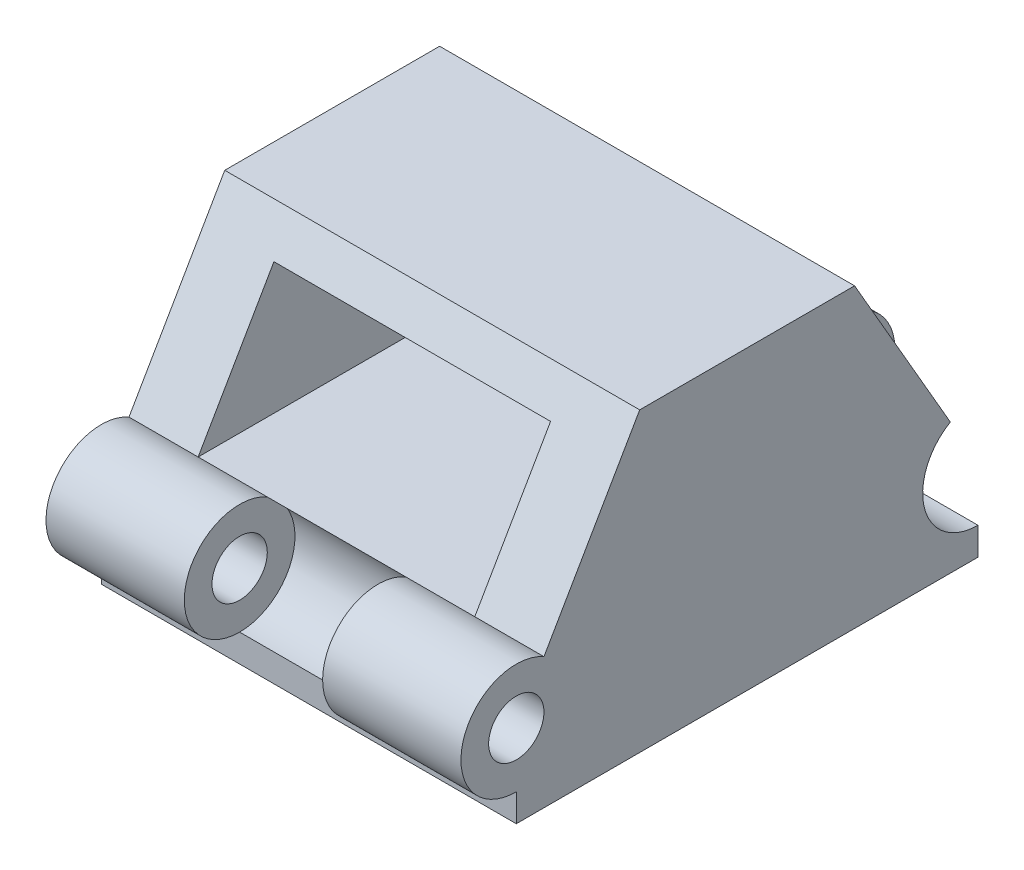
ISO-10303-21;
HEADER;
FILE_DESCRIPTION(('STEP AP214'),'2;1');
FILE_NAME('part.step','',(''),(''),'','','');
FILE_SCHEMA(('AUTOMOTIVE_DESIGN { 1 0 10303 214 1 1 1 1 }'));
ENDSEC;
DATA;
#1=APPLICATION_CONTEXT('core data for automotive mechanical design processes');
#2=APPLICATION_PROTOCOL_DEFINITION('international standard','automotive_design',2000,#1);
#3=PRODUCT_CONTEXT('',#1,'mechanical');
#4=PRODUCT('Part','Part','',(#3));
#5=PRODUCT_RELATED_PRODUCT_CATEGORY('part','',(#4));
#6=PRODUCT_DEFINITION_FORMATION('','',#4);
#7=PRODUCT_DEFINITION_CONTEXT('part definition',#1,'design');
#8=PRODUCT_DEFINITION('design','',#6,#7);
#9=PRODUCT_DEFINITION_SHAPE('','',#8);
#10=(LENGTH_UNIT() NAMED_UNIT(*) SI_UNIT(.MILLI.,.METRE.));
#11=(NAMED_UNIT(*) PLANE_ANGLE_UNIT() SI_UNIT($,.RADIAN.));
#12=(NAMED_UNIT(*) SI_UNIT($,.STERADIAN.) SOLID_ANGLE_UNIT());
#13=UNCERTAINTY_MEASURE_WITH_UNIT(LENGTH_MEASURE(1.E-05),#10,'distance_accuracy_value','');
#14=(GEOMETRIC_REPRESENTATION_CONTEXT(3) GLOBAL_UNCERTAINTY_ASSIGNED_CONTEXT((#13)) GLOBAL_UNIT_ASSIGNED_CONTEXT((#10,
#11,#12)) REPRESENTATION_CONTEXT('',''));
#15=CARTESIAN_POINT('',(0.,0.,0.));
#16=DIRECTION('',(0.,0.,1.));
#17=DIRECTION('',(1.,0.,0.));
#18=AXIS2_PLACEMENT_3D('',#15,#16,#17);
#19=CARTESIAN_POINT('',(0.,4.0000000000263,-35.6905989233398));
#20=DIRECTION('',(1.,0.,0.));
#21=DIRECTION('',(0.,0.,-1.));
#22=AXIS2_PLACEMENT_3D('',#19,#20,#21);
#23=CYLINDRICAL_SURFACE('',#22,4.00000000002631);
#24=DIRECTION('',(1.,0.,0.));
#25=VECTOR('',#24,1.);
#26=CARTESIAN_POINT('',(0.,7.46410161513778,-33.6905989232417));
#27=LINE('',#26,#25);
#28=CARTESIAN_POINT('',(10.,7.46410161513778,-33.6905989232417));
#29=VERTEX_POINT('',#28);
#30=CARTESIAN_POINT('',(20.,7.46410161513778,-33.6905989232417));
#31=VERTEX_POINT('',#30);
#32=EDGE_CURVE('E223',#29,#31,#27,.T.);
#33=ORIENTED_EDGE('',*,*,#32,.T.);
#34=CARTESIAN_POINT('',(20.,4.0000000000263,-35.6905989233398));
#35=DIRECTION('',(1.,0.,0.));
#36=DIRECTION('',(0.,0.,-1.));
#37=AXIS2_PLACEMENT_3D('',#34,#35,#36);
#38=CIRCLE('',#37,4.00000000002631);
#39=CARTESIAN_POINT('',(20.,0.,-35.6905989232417));
#40=VERTEX_POINT('',#39);
#41=EDGE_CURVE('E245',#40,#31,#38,.T.);
#42=ORIENTED_EDGE('',*,*,#41,.F.);
#43=DIRECTION('',(1.,0.,0.));
#44=VECTOR('',#43,1.);
#45=CARTESIAN_POINT('',(0.,0.,-35.6905989232417));
#46=LINE('',#45,#44);
#47=CARTESIAN_POINT('',(10.,0.,-35.6905989233398));
#48=VERTEX_POINT('',#47);
#49=EDGE_CURVE('E278',#48,#40,#46,.T.);
#50=ORIENTED_EDGE('',*,*,#49,.F.);
#51=CARTESIAN_POINT('',(10.,4.0000000000263,-35.6905989233398));
#52=DIRECTION('',(1.,0.,0.));
#53=DIRECTION('',(0.,0.,-1.));
#54=AXIS2_PLACEMENT_3D('',#51,#52,#53);
#55=CIRCLE('',#54,4.00000000002631);
#56=EDGE_CURVE('E231',#48,#29,#55,.T.);
#57=ORIENTED_EDGE('',*,*,#56,.T.);
#58=EDGE_LOOP('',(#33,#42,#50,#57));
#59=FACE_BOUND('',#58,.T.);
#60=ADVANCED_FACE('F38',(#59),#23,.T.);
#61=CARTESIAN_POINT('',(0.,4.0000000000263,-35.6905989233398));
#62=DIRECTION('',(1.,0.,0.));
#63=DIRECTION('',(0.,0.,-1.));
#64=AXIS2_PLACEMENT_3D('',#61,#62,#63);
#65=CYLINDRICAL_SURFACE('',#64,2.);
#66=CARTESIAN_POINT('',(10.,4.0000000000263,-35.6905989233398));
#67=DIRECTION('',(1.,0.,0.));
#68=DIRECTION('',(0.,0.,-1.));
#69=AXIS2_PLACEMENT_3D('',#66,#67,#68);
#70=CIRCLE('',#69,2.);
#71=CARTESIAN_POINT('',(10.,4.0000000000263,-37.6905989233398));
#72=VERTEX_POINT('',#71);
#73=EDGE_CURVE('E228',#72,#72,#70,.T.);
#74=ORIENTED_EDGE('',*,*,#73,.F.);
#75=EDGE_LOOP('',(#74));
#76=FACE_BOUND('',#75,.T.);
#77=CARTESIAN_POINT('',(20.,4.0000000000263,-35.6905989233398));
#78=DIRECTION('',(1.,0.,0.));
#79=DIRECTION('',(0.,0.,-1.));
#80=AXIS2_PLACEMENT_3D('',#77,#78,#79);
#81=CIRCLE('',#80,2.);
#82=CARTESIAN_POINT('',(20.,4.0000000000263,-37.6905989233398));
#83=VERTEX_POINT('',#82);
#84=EDGE_CURVE('E235',#83,#83,#81,.T.);
#85=ORIENTED_EDGE('',*,*,#84,.T.);
#86=EDGE_LOOP('',(#85));
#87=FACE_BOUND('',#86,.T.);
#88=ADVANCED_FACE('F374',(#76,#87),#65,.F.);
#89=CARTESIAN_POINT('',(0.,4.,-2.3094010767586));
#90=DIRECTION('',(1.,0.,0.));
#91=DIRECTION('',(0.,0.,-1.));
#92=AXIS2_PLACEMENT_3D('',#89,#90,#91);
#93=CYLINDRICAL_SURFACE('',#92,4.);
#94=DIRECTION('',(1.,0.,0.));
#95=VECTOR('',#94,1.);
#96=CARTESIAN_POINT('',(0.,7.46410161513778,-4.30940107675856));
#97=LINE('',#96,#95);
#98=CARTESIAN_POINT('',(5.,7.46410161513778,-4.30940107675856));
#99=VERTEX_POINT('',#98);
#100=CARTESIAN_POINT('',(10.,7.46410161513778,-4.30940107675856));
#101=VERTEX_POINT('',#100);
#102=EDGE_CURVE('E220',#99,#101,#97,.T.);
#103=ORIENTED_EDGE('',*,*,#102,.F.);
#104=DIRECTION('',(1.,0.,0.));
#105=VECTOR('',#104,1.);
#106=CARTESIAN_POINT('',(0.,7.46410161513778,-4.30940107675856));
#107=LINE('',#106,#105);
#108=CARTESIAN_POINT('',(0.,7.46410161513778,-4.30940107675856));
#109=VERTEX_POINT('',#108);
#110=EDGE_CURVE('E158',#109,#99,#107,.T.);
#111=ORIENTED_EDGE('',*,*,#110,.F.);
#112=CARTESIAN_POINT('',(0.,4.,-2.3094010767586));
#113=DIRECTION('',(1.,0.,0.));
#114=DIRECTION('',(0.,0.,-1.));
#115=AXIS2_PLACEMENT_3D('',#112,#113,#114);
#116=CIRCLE('',#115,4.);
#117=CARTESIAN_POINT('',(0.,0.,-2.3094010767586));
#118=VERTEX_POINT('',#117);
#119=EDGE_CURVE('E263',#109,#118,#116,.T.);
#120=ORIENTED_EDGE('',*,*,#119,.T.);
#121=DIRECTION('',(1.,0.,0.));
#122=VECTOR('',#121,1.);
#123=CARTESIAN_POINT('',(0.,0.,-2.3094010767586));
#124=LINE('',#123,#122);
#125=CARTESIAN_POINT('',(10.,0.,-2.3094010767586));
#126=VERTEX_POINT('',#125);
#127=EDGE_CURVE('E271',#118,#126,#124,.T.);
#128=ORIENTED_EDGE('',*,*,#127,.T.);
#129=CARTESIAN_POINT('',(10.,4.,-2.3094010767586));
#130=DIRECTION('',(1.,0.,0.));
#131=DIRECTION('',(0.,0.,-1.));
#132=AXIS2_PLACEMENT_3D('',#129,#130,#131);
#133=CIRCLE('',#132,4.);
#134=EDGE_CURVE('E53',#101,#126,#133,.T.);
#135=ORIENTED_EDGE('',*,*,#134,.F.);
#136=EDGE_LOOP('',(#103,#111,#120,#128,#135));
#137=FACE_BOUND('',#136,.T.);
#138=ADVANCED_FACE('F312',(#137),#93,.T.);
#139=CARTESIAN_POINT('',(0.,4.,-2.3094010767586));
#140=DIRECTION('',(1.,0.,0.));
#141=DIRECTION('',(0.,0.,-1.));
#142=AXIS2_PLACEMENT_3D('',#139,#140,#141);
#143=CYLINDRICAL_SURFACE('',#142,2.);
#144=CARTESIAN_POINT('',(0.,4.,-2.3094010767586));
#145=DIRECTION('',(1.,0.,0.));
#146=DIRECTION('',(0.,0.,-1.));
#147=AXIS2_PLACEMENT_3D('',#144,#145,#146);
#148=CIRCLE('',#147,2.);
#149=CARTESIAN_POINT('',(0.,4.,-4.3094010767586));
#150=VERTEX_POINT('',#149);
#151=EDGE_CURVE('E256',#150,#150,#148,.T.);
#152=ORIENTED_EDGE('',*,*,#151,.F.);
#153=EDGE_LOOP('',(#152));
#154=FACE_BOUND('',#153,.T.);
#155=CARTESIAN_POINT('',(10.,4.,-2.3094010767586));
#156=DIRECTION('',(1.,0.,0.));
#157=DIRECTION('',(0.,0.,-1.));
#158=AXIS2_PLACEMENT_3D('',#155,#156,#157);
#159=CIRCLE('',#158,2.);
#160=CARTESIAN_POINT('',(10.,4.,-4.3094010767586));
#161=VERTEX_POINT('',#160);
#162=EDGE_CURVE('E247',#161,#161,#159,.T.);
#163=ORIENTED_EDGE('',*,*,#162,.T.);
#164=EDGE_LOOP('',(#163));
#165=FACE_BOUND('',#164,.T.);
#166=ADVANCED_FACE('F395',(#154,#165),#143,.F.);
#167=CARTESIAN_POINT('',(30.,16.4544826719043,-28.5000000000001));
#168=DIRECTION('',(0.,-0.500000000000004,0.866025403784436));
#169=DIRECTION('',(0.,-0.866025403784436,-0.500000000000004));
#170=AXIS2_PLACEMENT_3D('',#167,#168,#169);
#171=PLANE('',#170);
#172=DIRECTION('',(0.,0.866025403784436,0.500000000000004));
#173=VECTOR('',#172,1.);
#174=CARTESIAN_POINT('',(25.,16.4544826719043,-28.5000000000001));
#175=LINE('',#174,#173);
#176=CARTESIAN_POINT('',(25.,7.46410161513774,-33.6905989232416));
#177=VERTEX_POINT('',#176);
#178=CARTESIAN_POINT('',(25.,16.9544826719043,-28.2113248654053));
#179=VERTEX_POINT('',#178);
#180=EDGE_CURVE('E277',#177,#179,#175,.T.);
#181=ORIENTED_EDGE('',*,*,#180,.T.);
#182=DIRECTION('',(-1.,0.,0.));
#183=VECTOR('',#182,1.);
#184=CARTESIAN_POINT('',(30.,16.9544826719043,-28.2113248654053));
#185=LINE('',#184,#183);
#186=CARTESIAN_POINT('',(5.,16.9544826719043,-28.2113248654052));
#187=VERTEX_POINT('',#186);
#188=EDGE_CURVE('E176',#179,#187,#185,.T.);
#189=ORIENTED_EDGE('',*,*,#188,.T.);
#190=DIRECTION('',(0.,-0.866025403784436,-0.500000000000004));
#191=VECTOR('',#190,1.);
#192=CARTESIAN_POINT('',(5.,16.4544826719043,-28.5000000000001));
#193=LINE('',#192,#191);
#194=CARTESIAN_POINT('',(5.,7.46410161513774,-33.6905989232416));
#195=VERTEX_POINT('',#194);
#196=EDGE_CURVE('E174',#187,#195,#193,.T.);
#197=ORIENTED_EDGE('',*,*,#196,.T.);
#198=DIRECTION('',(1.,0.,0.));
#199=VECTOR('',#198,1.);
#200=CARTESIAN_POINT('',(0.,7.46410161513774,-33.6905989232416));
#201=LINE('',#200,#199);
#202=CARTESIAN_POINT('',(0.,7.46410161513774,-33.6905989232416));
#203=VERTEX_POINT('',#202);
#204=EDGE_CURVE('E280',#203,#195,#201,.T.);
#205=ORIENTED_EDGE('',*,*,#204,.F.);
#206=DIRECTION('',(0.,0.866025403784436,0.500000000000004));
#207=VECTOR('',#206,1.);
#208=CARTESIAN_POINT('',(0.,16.4544826719043,-28.5000000000001));
#209=LINE('',#208,#207);
#210=CARTESIAN_POINT('',(0.,19.4544826719043,-26.7679491924313));
#211=VERTEX_POINT('',#210);
#212=EDGE_CURVE('E285',#203,#211,#209,.T.);
#213=ORIENTED_EDGE('',*,*,#212,.T.);
#214=DIRECTION('',(1.,0.,0.));
#215=VECTOR('',#214,1.);
#216=CARTESIAN_POINT('',(0.,19.4544826719043,-26.7679491924313));
#217=LINE('',#216,#215);
#218=CARTESIAN_POINT('',(30.,19.4544826719043,-26.7679491924313));
#219=VERTEX_POINT('',#218);
#220=EDGE_CURVE('E184',#211,#219,#217,.T.);
#221=ORIENTED_EDGE('',*,*,#220,.T.);
#222=DIRECTION('',(0.,0.866025403784436,0.500000000000004));
#223=VECTOR('',#222,1.);
#224=CARTESIAN_POINT('',(30.,16.4544826719043,-28.5000000000001));
#225=LINE('',#224,#223);
#226=CARTESIAN_POINT('',(30.,7.46410161513774,-33.6905989232416));
#227=VERTEX_POINT('',#226);
#228=EDGE_CURVE('E286',#227,#219,#225,.T.);
#229=ORIENTED_EDGE('',*,*,#228,.F.);
#230=EDGE_CURVE('E269',#177,#227,#201,.T.);
#231=ORIENTED_EDGE('',*,*,#230,.F.);
#232=EDGE_LOOP('',(#181,#189,#197,#205,#213,#221,#229,#231));
#233=FACE_BOUND('',#232,.T.);
#234=ADVANCED_FACE('F40',(#233),#171,.F.);
#235=CARTESIAN_POINT('',(30.,0.,0.));
#236=DIRECTION('',(0.,-0.500000000000004,-0.866025403784436));
#237=DIRECTION('',(0.,0.866025403784436,-0.500000000000004));
#238=AXIS2_PLACEMENT_3D('',#235,#236,#237);
#239=PLANE('',#238);
#240=DIRECTION('',(1.,0.,0.));
#241=VECTOR('',#240,1.);
#242=CARTESIAN_POINT('',(30.,16.9544826719043,-9.78867513459489));
#243=LINE('',#242,#241);
#244=CARTESIAN_POINT('',(5.,16.9544826719043,-9.78867513459489));
#245=VERTEX_POINT('',#244);
#246=CARTESIAN_POINT('',(25.,16.9544826719043,-9.78867513459489));
#247=VERTEX_POINT('',#246);
#248=EDGE_CURVE('E11',#245,#247,#243,.T.);
#249=ORIENTED_EDGE('',*,*,#248,.T.);
#250=DIRECTION('',(0.,-0.866025403784436,0.500000000000004));
#251=VECTOR('',#250,1.);
#252=CARTESIAN_POINT('',(25.,0.,0.));
#253=LINE('',#252,#251);
#254=CARTESIAN_POINT('',(25.,7.46410161513778,-4.30940107675856));
#255=VERTEX_POINT('',#254);
#256=EDGE_CURVE('E162',#247,#255,#253,.T.);
#257=ORIENTED_EDGE('',*,*,#256,.T.);
#258=CARTESIAN_POINT('',(30.,7.46410161513778,-4.30940107675856));
#259=VERTEX_POINT('',#258);
#260=EDGE_CURVE('E270',#255,#259,#107,.T.);
#261=ORIENTED_EDGE('',*,*,#260,.T.);
#262=DIRECTION('',(0.,-0.866025403784436,0.500000000000004));
#263=VECTOR('',#262,1.);
#264=CARTESIAN_POINT('',(30.,0.,0.));
#265=LINE('',#264,#263);
#266=CARTESIAN_POINT('',(30.,19.4544826719043,-11.2320508075689));
#267=VERTEX_POINT('',#266);
#268=EDGE_CURVE('E288',#267,#259,#265,.T.);
#269=ORIENTED_EDGE('',*,*,#268,.F.);
#270=DIRECTION('',(1.,0.,0.));
#271=VECTOR('',#270,1.);
#272=CARTESIAN_POINT('',(0.,19.4544826719043,-11.2320508075689));
#273=LINE('',#272,#271);
#274=CARTESIAN_POINT('',(0.,19.4544826719043,-11.2320508075689));
#275=VERTEX_POINT('',#274);
#276=EDGE_CURVE('E187',#275,#267,#273,.T.);
#277=ORIENTED_EDGE('',*,*,#276,.F.);
#278=DIRECTION('',(0.,-0.866025403784436,0.500000000000004));
#279=VECTOR('',#278,1.);
#280=CARTESIAN_POINT('',(0.,0.,0.));
#281=LINE('',#280,#279);
#282=EDGE_CURVE('E289',#275,#109,#281,.T.);
#283=ORIENTED_EDGE('',*,*,#282,.T.);
#284=ORIENTED_EDGE('',*,*,#110,.T.);
#285=DIRECTION('',(0.,0.866025403784436,-0.500000000000004));
#286=VECTOR('',#285,1.);
#287=CARTESIAN_POINT('',(5.,0.,0.));
#288=LINE('',#287,#286);
#289=EDGE_CURVE('E46',#99,#245,#288,.T.);
#290=ORIENTED_EDGE('',*,*,#289,.T.);
#291=EDGE_LOOP('',(#249,#257,#261,#269,#277,#283,#284,#290));
#292=FACE_BOUND('',#291,.T.);
#293=ADVANCED_FACE('F155',(#292),#239,.F.);
#294=CARTESIAN_POINT('',(30.,0.,0.));
#295=DIRECTION('',(-1.,0.,0.));
#296=DIRECTION('',(0.,0.,1.));
#297=AXIS2_PLACEMENT_3D('',#294,#295,#296);
#298=PLANE('',#297);
#299=ORIENTED_EDGE('',*,*,#268,.T.);
#300=CARTESIAN_POINT('',(30.,4.,-2.3094010767586));
#301=DIRECTION('',(1.,0.,0.));
#302=DIRECTION('',(0.,0.,-1.));
#303=AXIS2_PLACEMENT_3D('',#300,#301,#302);
#304=CIRCLE('',#303,4.);
#305=CARTESIAN_POINT('',(30.,0.,-2.3094010767586));
#306=VERTEX_POINT('',#305);
#307=EDGE_CURVE('E259',#259,#306,#304,.T.);
#308=ORIENTED_EDGE('',*,*,#307,.T.);
#309=DIRECTION('',(0.,1.,0.));
#310=VECTOR('',#309,1.);
#311=CARTESIAN_POINT('',(30.,0.,-2.30940107675856));
#312=LINE('',#311,#310);
#313=CARTESIAN_POINT('',(30.,-2.,-2.3094010767586));
#314=VERTEX_POINT('',#313);
#315=EDGE_CURVE('E200',#314,#306,#312,.T.);
#316=ORIENTED_EDGE('',*,*,#315,.F.);
#317=DIRECTION('',(0.,0.,1.));
#318=VECTOR('',#317,1.);
#319=CARTESIAN_POINT('',(30.,-2.,-35.6905989233398));
#320=LINE('',#319,#318);
#321=CARTESIAN_POINT('',(30.,-2.,-35.6905989233398));
#322=VERTEX_POINT('',#321);
#323=EDGE_CURVE('E196',#322,#314,#320,.T.);
#324=ORIENTED_EDGE('',*,*,#323,.F.);
#325=DIRECTION('',(0.,-1.,0.));
#326=VECTOR('',#325,1.);
#327=CARTESIAN_POINT('',(30.,0.,-35.6905989233398));
#328=LINE('',#327,#326);
#329=CARTESIAN_POINT('',(30.,0.,-35.6905989232417));
#330=VERTEX_POINT('',#329);
#331=EDGE_CURVE('E193',#330,#322,#328,.T.);
#332=ORIENTED_EDGE('',*,*,#331,.F.);
#333=CARTESIAN_POINT('',(30.,4.0000000000263,-35.6905989233398));
#334=DIRECTION('',(1.,0.,0.));
#335=DIRECTION('',(0.,0.,-1.));
#336=AXIS2_PLACEMENT_3D('',#333,#334,#335);
#337=CIRCLE('',#336,4.00000000002631);
#338=EDGE_CURVE('E241',#227,#330,#337,.T.);
#339=ORIENTED_EDGE('',*,*,#338,.F.);
#340=ORIENTED_EDGE('',*,*,#228,.T.);
#341=DIRECTION('',(0.,0.,1.));
#342=VECTOR('',#341,1.);
#343=CARTESIAN_POINT('',(30.,19.4544826719043,-26.7679491924313));
#344=LINE('',#343,#342);
#345=EDGE_CURVE('E180',#219,#267,#344,.T.);
#346=ORIENTED_EDGE('',*,*,#345,.T.);
#347=EDGE_LOOP('',(#299,#308,#316,#324,#332,#339,#340,#346));
#348=FACE_BOUND('',#347,.T.);
#349=CARTESIAN_POINT('',(30.,4.,-2.3094010767586));
#350=DIRECTION('',(1.,0.,0.));
#351=DIRECTION('',(0.,0.,-1.));
#352=AXIS2_PLACEMENT_3D('',#349,#350,#351);
#353=CIRCLE('',#352,2.);
#354=CARTESIAN_POINT('',(30.,4.,-4.3094010767586));
#355=VERTEX_POINT('',#354);
#356=EDGE_CURVE('E260',#355,#355,#353,.T.);
#357=ORIENTED_EDGE('',*,*,#356,.F.);
#358=EDGE_LOOP('',(#357));
#359=FACE_BOUND('',#358,.T.);
#360=ADVANCED_FACE('F319',(#348,#359),#298,.F.);
#361=CARTESIAN_POINT('',(0.,0.,0.));
#362=DIRECTION('',(-1.,0.,0.));
#363=DIRECTION('',(0.,0.,1.));
#364=AXIS2_PLACEMENT_3D('',#361,#362,#363);
#365=PLANE('',#364);
#366=ORIENTED_EDGE('',*,*,#212,.F.);
#367=CARTESIAN_POINT('',(0.,4.0000000000263,-35.6905989233398));
#368=DIRECTION('',(1.,0.,0.));
#369=DIRECTION('',(0.,0.,-1.));
#370=AXIS2_PLACEMENT_3D('',#367,#368,#369);
#371=CIRCLE('',#370,4.00000000002631);
#372=CARTESIAN_POINT('',(0.,0.,-35.6905989233398));
#373=VERTEX_POINT('',#372);
#374=EDGE_CURVE('E232',#203,#373,#371,.T.);
#375=ORIENTED_EDGE('',*,*,#374,.T.);
#376=DIRECTION('',(0.,-1.,0.));
#377=VECTOR('',#376,1.);
#378=CARTESIAN_POINT('',(0.,0.,-35.6905989233398));
#379=LINE('',#378,#377);
#380=CARTESIAN_POINT('',(0.,-2.,-35.6905989233398));
#381=VERTEX_POINT('',#380);
#382=EDGE_CURVE('E190',#373,#381,#379,.T.);
#383=ORIENTED_EDGE('',*,*,#382,.T.);
#384=DIRECTION('',(0.,0.,1.));
#385=VECTOR('',#384,1.);
#386=CARTESIAN_POINT('',(0.,-2.,-35.6905989233398));
#387=LINE('',#386,#385);
#388=CARTESIAN_POINT('',(0.,-2.,-2.3094010767586));
#389=VERTEX_POINT('',#388);
#390=EDGE_CURVE('E206',#381,#389,#387,.T.);
#391=ORIENTED_EDGE('',*,*,#390,.T.);
#392=DIRECTION('',(0.,1.,0.));
#393=VECTOR('',#392,1.);
#394=CARTESIAN_POINT('',(0.,0.,-2.30940107675856));
#395=LINE('',#394,#393);
#396=EDGE_CURVE('E197',#389,#118,#395,.T.);
#397=ORIENTED_EDGE('',*,*,#396,.T.);
#398=ORIENTED_EDGE('',*,*,#119,.F.);
#399=ORIENTED_EDGE('',*,*,#282,.F.);
#400=DIRECTION('',(0.,0.,1.));
#401=VECTOR('',#400,1.);
#402=CARTESIAN_POINT('',(0.,19.4544826719043,-26.7679491924313));
#403=LINE('',#402,#401);
#404=EDGE_CURVE('E181',#211,#275,#403,.T.);
#405=ORIENTED_EDGE('',*,*,#404,.F.);
#406=EDGE_LOOP('',(#366,#375,#383,#391,#397,#398,#399,#405));
#407=FACE_BOUND('',#406,.T.);
#408=ORIENTED_EDGE('',*,*,#151,.T.);
#409=EDGE_LOOP('',(#408));
#410=FACE_BOUND('',#409,.T.);
#411=ADVANCED_FACE('F357',(#407,#410),#365,.T.);
#412=CARTESIAN_POINT('',(5.,13.4544826719043,-38.0000000000002));
#413=DIRECTION('',(-1.,0.,0.));
#414=DIRECTION('',(0.,-1.,0.));
#415=AXIS2_PLACEMENT_3D('',#412,#413,#414);
#416=PLANE('',#415);
#417=ORIENTED_EDGE('',*,*,#289,.F.);
#418=DIRECTION('',(0.,0.,-1.));
#419=VECTOR('',#418,1.);
#420=CARTESIAN_POINT('',(5.,7.46410161513778,-38.0000000000002));
#421=LINE('',#420,#419);
#422=EDGE_CURVE('E226',#99,#195,#421,.T.);
#423=ORIENTED_EDGE('',*,*,#422,.T.);
#424=ORIENTED_EDGE('',*,*,#196,.F.);
#425=DIRECTION('',(0.,0.,-1.));
#426=VECTOR('',#425,1.);
#427=CARTESIAN_POINT('',(5.,16.9544826719043,-5.69059892333982));
#428=LINE('',#427,#426);
#429=EDGE_CURVE('E168',#245,#187,#428,.T.);
#430=ORIENTED_EDGE('',*,*,#429,.F.);
#431=EDGE_LOOP('',(#417,#423,#424,#430));
#432=FACE_BOUND('',#431,.T.);
#433=ADVANCED_FACE('F172',(#432),#416,.F.);
#434=CARTESIAN_POINT('',(25.,13.4544826719043,-38.0000000000002));
#435=DIRECTION('',(1.,0.,0.));
#436=DIRECTION('',(0.,0.,-1.));
#437=AXIS2_PLACEMENT_3D('',#434,#435,#436);
#438=PLANE('',#437);
#439=ORIENTED_EDGE('',*,*,#180,.F.);
#440=DIRECTION('',(0.,0.,1.));
#441=VECTOR('',#440,1.);
#442=CARTESIAN_POINT('',(25.,7.46410161513778,-38.0000000000002));
#443=LINE('',#442,#441);
#444=EDGE_CURVE('E224',#177,#255,#443,.T.);
#445=ORIENTED_EDGE('',*,*,#444,.T.);
#446=ORIENTED_EDGE('',*,*,#256,.F.);
#447=DIRECTION('',(0.,0.,-1.));
#448=VECTOR('',#447,1.);
#449=CARTESIAN_POINT('',(25.,16.9544826719043,-5.69059892333982));
#450=LINE('',#449,#448);
#451=EDGE_CURVE('E171',#247,#179,#450,.T.);
#452=ORIENTED_EDGE('',*,*,#451,.T.);
#453=EDGE_LOOP('',(#439,#445,#446,#452));
#454=FACE_BOUND('',#453,.T.);
#455=ADVANCED_FACE('F383',(#454),#438,.F.);
#456=CARTESIAN_POINT('',(20.,7.46410161513778,-4.30940107675856));
#457=VERTEX_POINT('',#456);
#458=EDGE_CURVE('E215',#457,#255,#97,.T.);
#459=ORIENTED_EDGE('',*,*,#458,.F.);
#460=CARTESIAN_POINT('',(20.,4.,-2.3094010767586));
#461=DIRECTION('',(1.,0.,0.));
#462=DIRECTION('',(0.,0.,-1.));
#463=AXIS2_PLACEMENT_3D('',#460,#461,#462);
#464=CIRCLE('',#463,4.);
#465=CARTESIAN_POINT('',(20.,0.,-2.3094010767586));
#466=VERTEX_POINT('',#465);
#467=EDGE_CURVE('E250',#457,#466,#464,.T.);
#468=ORIENTED_EDGE('',*,*,#467,.T.);
#469=EDGE_CURVE('E265',#466,#306,#124,.T.);
#470=ORIENTED_EDGE('',*,*,#469,.T.);
#471=ORIENTED_EDGE('',*,*,#307,.F.);
#472=ORIENTED_EDGE('',*,*,#260,.F.);
#473=EDGE_LOOP('',(#459,#468,#470,#471,#472));
#474=FACE_BOUND('',#473,.T.);
#475=ADVANCED_FACE('F298',(#474),#93,.T.);
#476=CARTESIAN_POINT('',(20.,4.,-2.3094010767586));
#477=DIRECTION('',(1.,0.,0.));
#478=DIRECTION('',(0.,0.,-1.));
#479=AXIS2_PLACEMENT_3D('',#476,#477,#478);
#480=CIRCLE('',#479,2.);
#481=CARTESIAN_POINT('',(20.,4.,-4.3094010767586));
#482=VERTEX_POINT('',#481);
#483=EDGE_CURVE('E244',#482,#482,#480,.T.);
#484=ORIENTED_EDGE('',*,*,#483,.F.);
#485=EDGE_LOOP('',(#484));
#486=FACE_BOUND('',#485,.T.);
#487=ORIENTED_EDGE('',*,*,#356,.T.);
#488=EDGE_LOOP('',(#487));
#489=FACE_BOUND('',#488,.T.);
#490=ADVANCED_FACE('F401',(#486,#489),#143,.F.);
#491=CARTESIAN_POINT('',(10.,4.,-2.3094010767586));
#492=DIRECTION('',(1.,0.,0.));
#493=DIRECTION('',(0.,0.,-1.));
#494=AXIS2_PLACEMENT_3D('',#491,#492,#493);
#495=CYLINDRICAL_SURFACE('',#494,4.);
#496=EDGE_CURVE('E273',#126,#466,#124,.T.);
#497=ORIENTED_EDGE('',*,*,#496,.T.);
#498=EDGE_CURVE('E61',#466,#457,#464,.T.);
#499=ORIENTED_EDGE('',*,*,#498,.T.);
#500=EDGE_CURVE('E218',#101,#457,#97,.T.);
#501=ORIENTED_EDGE('',*,*,#500,.F.);
#502=EDGE_CURVE('E254',#126,#101,#133,.T.);
#503=ORIENTED_EDGE('',*,*,#502,.F.);
#504=EDGE_LOOP('',(#497,#499,#501,#503));
#505=FACE_BOUND('',#504,.T.);
#506=ADVANCED_FACE('F306',(#505),#495,.F.);
#507=CARTESIAN_POINT('',(10.,4.,-2.3094010767586));
#508=DIRECTION('',(1.,0.,0.));
#509=DIRECTION('',(0.,0.,-1.));
#510=AXIS2_PLACEMENT_3D('',#507,#508,#509);
#511=PLANE('',#510);
#512=ORIENTED_EDGE('',*,*,#162,.F.);
#513=EDGE_LOOP('',(#512));
#514=FACE_BOUND('',#513,.T.);
#515=ORIENTED_EDGE('',*,*,#134,.T.);
#516=ORIENTED_EDGE('',*,*,#502,.T.);
#517=EDGE_LOOP('',(#515,#516));
#518=FACE_BOUND('',#517,.T.);
#519=ADVANCED_FACE('F310',(#514,#518),#511,.T.);
#520=CARTESIAN_POINT('',(20.,4.,-2.3094010767586));
#521=DIRECTION('',(1.,0.,0.));
#522=DIRECTION('',(0.,0.,-1.));
#523=AXIS2_PLACEMENT_3D('',#520,#521,#522);
#524=PLANE('',#523);
#525=ORIENTED_EDGE('',*,*,#483,.T.);
#526=EDGE_LOOP('',(#525));
#527=FACE_BOUND('',#526,.T.);
#528=ORIENTED_EDGE('',*,*,#498,.F.);
#529=ORIENTED_EDGE('',*,*,#467,.F.);
#530=EDGE_LOOP('',(#528,#529));
#531=FACE_BOUND('',#530,.T.);
#532=ADVANCED_FACE('F418',(#527,#531),#524,.F.);
#533=CARTESIAN_POINT('',(20.,4.0000000000263,-35.6905989233398));
#534=DIRECTION('',(1.,0.,0.));
#535=DIRECTION('',(0.,0.,-1.));
#536=AXIS2_PLACEMENT_3D('',#533,#534,#535);
#537=CYLINDRICAL_SURFACE('',#536,4.00000000002631);
#538=EDGE_CURVE('E242',#31,#40,#38,.T.);
#539=ORIENTED_EDGE('',*,*,#538,.F.);
#540=EDGE_CURVE('E213',#31,#177,#27,.T.);
#541=ORIENTED_EDGE('',*,*,#540,.T.);
#542=ORIENTED_EDGE('',*,*,#230,.T.);
#543=ORIENTED_EDGE('',*,*,#338,.T.);
#544=EDGE_CURVE('E279',#40,#330,#46,.T.);
#545=ORIENTED_EDGE('',*,*,#544,.F.);
#546=EDGE_LOOP('',(#539,#541,#542,#543,#545));
#547=FACE_BOUND('',#546,.T.);
#548=ADVANCED_FACE('F335',(#547),#537,.F.);
#549=CARTESIAN_POINT('',(20.,4.0000000000263,-35.6905989233398));
#550=DIRECTION('',(1.,0.,0.));
#551=DIRECTION('',(0.,0.,-1.));
#552=AXIS2_PLACEMENT_3D('',#549,#550,#551);
#553=PLANE('',#552);
#554=ORIENTED_EDGE('',*,*,#84,.F.);
#555=EDGE_LOOP('',(#554));
#556=FACE_BOUND('',#555,.T.);
#557=ORIENTED_EDGE('',*,*,#538,.T.);
#558=ORIENTED_EDGE('',*,*,#41,.T.);
#559=EDGE_LOOP('',(#557,#558));
#560=FACE_BOUND('',#559,.T.);
#561=ADVANCED_FACE('F342',(#556,#560),#553,.T.);
#562=CARTESIAN_POINT('',(0.,4.0000000000263,-35.6905989233398));
#563=DIRECTION('',(1.,0.,0.));
#564=DIRECTION('',(0.,0.,-1.));
#565=AXIS2_PLACEMENT_3D('',#562,#563,#564);
#566=CYLINDRICAL_SURFACE('',#565,4.00000000002631);
#567=ORIENTED_EDGE('',*,*,#204,.T.);
#568=EDGE_CURVE('E219',#195,#29,#27,.T.);
#569=ORIENTED_EDGE('',*,*,#568,.T.);
#570=EDGE_CURVE('E236',#29,#48,#55,.T.);
#571=ORIENTED_EDGE('',*,*,#570,.T.);
#572=EDGE_CURVE('E274',#373,#48,#46,.T.);
#573=ORIENTED_EDGE('',*,*,#572,.F.);
#574=ORIENTED_EDGE('',*,*,#374,.F.);
#575=EDGE_LOOP('',(#567,#569,#571,#573,#574));
#576=FACE_BOUND('',#575,.T.);
#577=ADVANCED_FACE('F360',(#576),#566,.F.);
#578=CARTESIAN_POINT('',(10.,4.0000000000263,-35.6905989233398));
#579=DIRECTION('',(1.,0.,0.));
#580=DIRECTION('',(0.,0.,-1.));
#581=AXIS2_PLACEMENT_3D('',#578,#579,#580);
#582=PLANE('',#581);
#583=ORIENTED_EDGE('',*,*,#73,.T.);
#584=EDGE_LOOP('',(#583));
#585=FACE_BOUND('',#584,.T.);
#586=ORIENTED_EDGE('',*,*,#570,.F.);
#587=ORIENTED_EDGE('',*,*,#56,.F.);
#588=EDGE_LOOP('',(#586,#587));
#589=FACE_BOUND('',#588,.T.);
#590=ADVANCED_FACE('F363',(#585,#589),#582,.F.);
#591=CARTESIAN_POINT('',(0.,7.46410161513778,-4.30940107675856));
#592=DIRECTION('',(0.,1.,0.));
#593=DIRECTION('',(0.,0.,1.));
#594=AXIS2_PLACEMENT_3D('',#591,#592,#593);
#595=PLANE('',#594);
#596=ORIENTED_EDGE('',*,*,#422,.F.);
#597=ORIENTED_EDGE('',*,*,#102,.T.);
#598=ORIENTED_EDGE('',*,*,#500,.T.);
#599=ORIENTED_EDGE('',*,*,#458,.T.);
#600=ORIENTED_EDGE('',*,*,#444,.F.);
#601=ORIENTED_EDGE('',*,*,#540,.F.);
#602=ORIENTED_EDGE('',*,*,#32,.F.);
#603=ORIENTED_EDGE('',*,*,#568,.F.);
#604=EDGE_LOOP('',(#596,#597,#598,#599,#600,#601,#602,#603));
#605=FACE_BOUND('',#604,.T.);
#606=ADVANCED_FACE('F303',(#605),#595,.T.);
#607=CARTESIAN_POINT('',(30.,0.,-35.6905989233398));
#608=DIRECTION('',(0.,0.,-1.));
#609=DIRECTION('',(-1.,0.,0.));
#610=AXIS2_PLACEMENT_3D('',#607,#608,#609);
#611=PLANE('',#610);
#612=ORIENTED_EDGE('',*,*,#382,.F.);
#613=ORIENTED_EDGE('',*,*,#572,.T.);
#614=ORIENTED_EDGE('',*,*,#49,.T.);
#615=ORIENTED_EDGE('',*,*,#544,.T.);
#616=ORIENTED_EDGE('',*,*,#331,.T.);
#617=DIRECTION('',(-1.,0.,0.));
#618=VECTOR('',#617,1.);
#619=CARTESIAN_POINT('',(30.,-2.,-35.6905989233398));
#620=LINE('',#619,#618);
#621=EDGE_CURVE('E203',#322,#381,#620,.T.);
#622=ORIENTED_EDGE('',*,*,#621,.T.);
#623=EDGE_LOOP('',(#612,#613,#614,#615,#616,#622));
#624=FACE_BOUND('',#623,.T.);
#625=ADVANCED_FACE('F330',(#624),#611,.T.);
#626=CARTESIAN_POINT('',(30.,0.,-2.30940107675856));
#627=DIRECTION('',(0.,0.,1.));
#628=DIRECTION('',(0.,-1.,0.));
#629=AXIS2_PLACEMENT_3D('',#626,#627,#628);
#630=PLANE('',#629);
#631=ORIENTED_EDGE('',*,*,#396,.F.);
#632=DIRECTION('',(-1.,0.,0.));
#633=VECTOR('',#632,1.);
#634=CARTESIAN_POINT('',(30.,-2.,-2.3094010767586));
#635=LINE('',#634,#633);
#636=EDGE_CURVE('E211',#314,#389,#635,.T.);
#637=ORIENTED_EDGE('',*,*,#636,.F.);
#638=ORIENTED_EDGE('',*,*,#315,.T.);
#639=ORIENTED_EDGE('',*,*,#469,.F.);
#640=ORIENTED_EDGE('',*,*,#496,.F.);
#641=ORIENTED_EDGE('',*,*,#127,.F.);
#642=EDGE_LOOP('',(#631,#637,#638,#639,#640,#641));
#643=FACE_BOUND('',#642,.T.);
#644=ADVANCED_FACE('F316',(#643),#630,.T.);
#645=CARTESIAN_POINT('',(30.,-2.,-35.6905989233398));
#646=DIRECTION('',(0.,-1.,0.));
#647=DIRECTION('',(0.,0.,-1.));
#648=AXIS2_PLACEMENT_3D('',#645,#646,#647);
#649=PLANE('',#648);
#650=ORIENTED_EDGE('',*,*,#390,.F.);
#651=ORIENTED_EDGE('',*,*,#621,.F.);
#652=ORIENTED_EDGE('',*,*,#323,.T.);
#653=ORIENTED_EDGE('',*,*,#636,.T.);
#654=EDGE_LOOP('',(#650,#651,#652,#653));
#655=FACE_BOUND('',#654,.T.);
#656=ADVANCED_FACE('F324',(#655),#649,.T.);
#657=CARTESIAN_POINT('',(0.,19.4544826719043,-26.7679491924313));
#658=DIRECTION('',(0.,1.,0.));
#659=DIRECTION('',(0.,0.,1.));
#660=AXIS2_PLACEMENT_3D('',#657,#658,#659);
#661=PLANE('',#660);
#662=ORIENTED_EDGE('',*,*,#345,.F.);
#663=ORIENTED_EDGE('',*,*,#220,.F.);
#664=ORIENTED_EDGE('',*,*,#404,.T.);
#665=ORIENTED_EDGE('',*,*,#276,.T.);
#666=EDGE_LOOP('',(#662,#663,#664,#665));
#667=FACE_BOUND('',#666,.T.);
#668=ADVANCED_FACE('F354',(#667),#661,.T.);
#669=CARTESIAN_POINT('',(25.,16.9544826719043,-5.69059892333982));
#670=DIRECTION('',(0.,1.,0.));
#671=DIRECTION('',(0.,0.,1.));
#672=AXIS2_PLACEMENT_3D('',#669,#670,#671);
#673=PLANE('',#672);
#674=ORIENTED_EDGE('',*,*,#451,.F.);
#675=ORIENTED_EDGE('',*,*,#248,.F.);
#676=ORIENTED_EDGE('',*,*,#429,.T.);
#677=ORIENTED_EDGE('',*,*,#188,.F.);
#678=EDGE_LOOP('',(#674,#675,#676,#677));
#679=FACE_BOUND('',#678,.T.);
#680=ADVANCED_FACE('F166',(#679),#673,.F.);
#681=CLOSED_SHELL('',(#60,#88,#138,#166,#234,#293,#360,#411,#433,#455,#475,#490,#506,#519,#532,
#548,#561,#577,#590,#606,#625,#644,#656,#668,#680));
#682=MANIFOLD_SOLID_BREP('B2',#681);
#683=ADVANCED_BREP_SHAPE_REPRESENTATION('',(#18,#682),#14);
#684=SHAPE_DEFINITION_REPRESENTATION(#9,#683);
ENDSEC;
END-ISO-10303-21;
